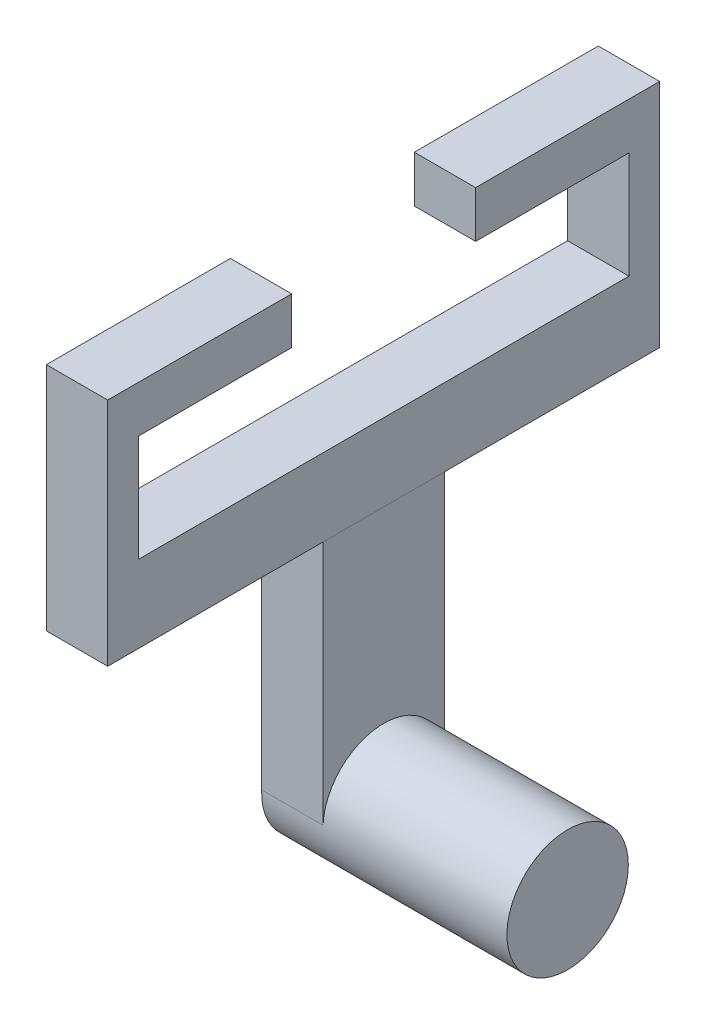
ISO-10303-21;
HEADER;
FILE_DESCRIPTION(('STEP AP214'),'2;1');
FILE_NAME('part.step','',(''),(''),'','','');
FILE_SCHEMA(('AUTOMOTIVE_DESIGN { 1 0 10303 214 1 1 1 1 }'));
ENDSEC;
DATA;
#1=APPLICATION_CONTEXT('core data for automotive mechanical design processes');
#2=APPLICATION_PROTOCOL_DEFINITION('international standard','automotive_design',2000,#1);
#3=PRODUCT_CONTEXT('',#1,'mechanical');
#4=PRODUCT('Part','Part','',(#3));
#5=PRODUCT_RELATED_PRODUCT_CATEGORY('part','',(#4));
#6=PRODUCT_DEFINITION_FORMATION('','',#4);
#7=PRODUCT_DEFINITION_CONTEXT('part definition',#1,'design');
#8=PRODUCT_DEFINITION('design','',#6,#7);
#9=PRODUCT_DEFINITION_SHAPE('','',#8);
#10=(LENGTH_UNIT() NAMED_UNIT(*) SI_UNIT(.MILLI.,.METRE.));
#11=(NAMED_UNIT(*) PLANE_ANGLE_UNIT() SI_UNIT($,.RADIAN.));
#12=(NAMED_UNIT(*) SI_UNIT($,.STERADIAN.) SOLID_ANGLE_UNIT());
#13=UNCERTAINTY_MEASURE_WITH_UNIT(LENGTH_MEASURE(1.E-05),#10,'distance_accuracy_value','');
#14=(GEOMETRIC_REPRESENTATION_CONTEXT(3) GLOBAL_UNCERTAINTY_ASSIGNED_CONTEXT((#13)) GLOBAL_UNIT_ASSIGNED_CONTEXT((#10,
#11,#12)) REPRESENTATION_CONTEXT('',''));
#15=CARTESIAN_POINT('',(0.,0.,0.));
#16=DIRECTION('',(0.,0.,1.));
#17=DIRECTION('',(1.,0.,0.));
#18=AXIS2_PLACEMENT_3D('',#15,#16,#17);
#19=CARTESIAN_POINT('',(12.7,51.3912941545788,-50.8));
#20=DIRECTION('',(0.,1.,0.));
#21=DIRECTION('',(0.,0.,1.));
#22=AXIS2_PLACEMENT_3D('',#19,#20,#21);
#23=PLANE('',#22);
#24=DIRECTION('',(0.,0.,-1.));
#25=VECTOR('',#24,1.);
#26=CARTESIAN_POINT('',(0.,51.3912941545788,-50.8));
#27=LINE('',#26,#25);
#28=CARTESIAN_POINT('',(0.,51.3912941545788,57.15));
#29=VERTEX_POINT('',#28);
#30=CARTESIAN_POINT('',(0.,51.3912941545788,-57.15));
#31=VERTEX_POINT('',#30);
#32=EDGE_CURVE('E273',#29,#31,#27,.T.);
#33=ORIENTED_EDGE('',*,*,#32,.T.);
#34=DIRECTION('',(1.,0.,0.));
#35=VECTOR('',#34,1.);
#36=CARTESIAN_POINT('',(0.,51.3912941545788,-57.15));
#37=LINE('',#36,#35);
#38=CARTESIAN_POINT('',(12.7,51.3912941545788,-57.15));
#39=VERTEX_POINT('',#38);
#40=EDGE_CURVE('E279',#31,#39,#37,.T.);
#41=ORIENTED_EDGE('',*,*,#40,.T.);
#42=DIRECTION('',(0.,0.,-1.));
#43=VECTOR('',#42,1.);
#44=CARTESIAN_POINT('',(12.7,51.3912941545788,-50.8));
#45=LINE('',#44,#43);
#46=CARTESIAN_POINT('',(12.7,51.3912941545788,57.15));
#47=VERTEX_POINT('',#46);
#48=EDGE_CURVE('E298',#47,#39,#45,.T.);
#49=ORIENTED_EDGE('',*,*,#48,.F.);
#50=DIRECTION('',(1.,0.,0.));
#51=VECTOR('',#50,1.);
#52=CARTESIAN_POINT('',(0.,51.3912941545788,57.15));
#53=LINE('',#52,#51);
#54=EDGE_CURVE('E272',#29,#47,#53,.T.);
#55=ORIENTED_EDGE('',*,*,#54,.F.);
#56=EDGE_LOOP('',(#33,#41,#49,#55));
#57=FACE_BOUND('',#56,.T.);
#58=ADVANCED_FACE('F89',(#57),#23,.F.);
#59=CARTESIAN_POINT('',(12.7,67.3932941545788,-50.8));
#60=DIRECTION('',(0.,-1.,0.));
#61=DIRECTION('',(0.,0.,-1.));
#62=AXIS2_PLACEMENT_3D('',#59,#60,#61);
#63=PLANE('',#62);
#64=DIRECTION('',(0.,0.,1.));
#65=VECTOR('',#64,1.);
#66=CARTESIAN_POINT('',(0.,67.3932941545788,-50.8));
#67=LINE('',#66,#65);
#68=CARTESIAN_POINT('',(0.,67.3932941545788,-50.8));
#69=VERTEX_POINT('',#68);
#70=CARTESIAN_POINT('',(0.,67.3932941545788,50.8));
#71=VERTEX_POINT('',#70);
#72=EDGE_CURVE('E299',#69,#71,#67,.T.);
#73=ORIENTED_EDGE('',*,*,#72,.T.);
#74=DIRECTION('',(-1.,0.,0.));
#75=VECTOR('',#74,1.);
#76=CARTESIAN_POINT('',(12.7,67.3932941545788,50.8));
#77=LINE('',#76,#75);
#78=CARTESIAN_POINT('',(12.7,67.3932941545788,50.8));
#79=VERTEX_POINT('',#78);
#80=EDGE_CURVE('E98',#79,#71,#77,.T.);
#81=ORIENTED_EDGE('',*,*,#80,.F.);
#82=DIRECTION('',(0.,0.,1.));
#83=VECTOR('',#82,1.);
#84=CARTESIAN_POINT('',(12.7,67.3932941545788,-50.8));
#85=LINE('',#84,#83);
#86=CARTESIAN_POINT('',(12.7,67.3932941545788,-50.8));
#87=VERTEX_POINT('',#86);
#88=EDGE_CURVE('E105',#87,#79,#85,.T.);
#89=ORIENTED_EDGE('',*,*,#88,.F.);
#90=DIRECTION('',(-1.,0.,0.));
#91=VECTOR('',#90,1.);
#92=CARTESIAN_POINT('',(12.7,67.3932941545788,-50.8));
#93=LINE('',#92,#91);
#94=EDGE_CURVE('E13',#87,#69,#93,.T.);
#95=ORIENTED_EDGE('',*,*,#94,.T.);
#96=EDGE_LOOP('',(#73,#81,#89,#95));
#97=FACE_BOUND('',#96,.T.);
#98=ADVANCED_FACE('F314',(#97),#63,.F.);
#99=CARTESIAN_POINT('',(12.7,0.,0.));
#100=DIRECTION('',(-1.,0.,0.));
#101=DIRECTION('',(0.,0.,1.));
#102=AXIS2_PLACEMENT_3D('',#99,#100,#101);
#103=PLANE('',#102);
#104=ORIENTED_EDGE('',*,*,#88,.T.);
#105=DIRECTION('',(0.,1.,0.));
#106=VECTOR('',#105,1.);
#107=CARTESIAN_POINT('',(12.7,51.3912941545788,50.8));
#108=LINE('',#107,#106);
#109=CARTESIAN_POINT('',(12.7,89.4912941545788,50.8));
#110=VERTEX_POINT('',#109);
#111=EDGE_CURVE('E265',#79,#110,#108,.T.);
#112=ORIENTED_EDGE('',*,*,#111,.T.);
#113=DIRECTION('',(0.,0.,-1.));
#114=VECTOR('',#113,1.);
#115=CARTESIAN_POINT('',(12.7,89.4912941545788,57.15));
#116=LINE('',#115,#114);
#117=CARTESIAN_POINT('',(12.7,89.4912941545788,19.05));
#118=VERTEX_POINT('',#117);
#119=EDGE_CURVE('E210',#110,#118,#116,.T.);
#120=ORIENTED_EDGE('',*,*,#119,.T.);
#121=DIRECTION('',(0.,1.,0.));
#122=VECTOR('',#121,1.);
#123=CARTESIAN_POINT('',(12.7,89.4912941545788,19.05));
#124=LINE('',#123,#122);
#125=CARTESIAN_POINT('',(12.7,99.1432941545788,19.05));
#126=VERTEX_POINT('',#125);
#127=EDGE_CURVE('E193',#118,#126,#124,.T.);
#128=ORIENTED_EDGE('',*,*,#127,.T.);
#129=DIRECTION('',(0.,0.,1.));
#130=VECTOR('',#129,1.);
#131=CARTESIAN_POINT('',(12.7,99.1432941545788,57.15));
#132=LINE('',#131,#130);
#133=CARTESIAN_POINT('',(12.7,99.1432941545788,57.15));
#134=VERTEX_POINT('',#133);
#135=EDGE_CURVE('E190',#126,#134,#132,.T.);
#136=ORIENTED_EDGE('',*,*,#135,.T.);
#137=DIRECTION('',(0.,-1.,0.));
#138=VECTOR('',#137,1.);
#139=CARTESIAN_POINT('',(12.7,51.3912941545788,57.15));
#140=LINE('',#139,#138);
#141=EDGE_CURVE('E260',#134,#47,#140,.T.);
#142=ORIENTED_EDGE('',*,*,#141,.T.);
#143=ORIENTED_EDGE('',*,*,#48,.T.);
#144=DIRECTION('',(0.,1.,0.));
#145=VECTOR('',#144,1.);
#146=CARTESIAN_POINT('',(12.7,51.3912941545788,-57.15));
#147=LINE('',#146,#145);
#148=CARTESIAN_POINT('',(12.7,99.1432941545788,-57.15));
#149=VERTEX_POINT('',#148);
#150=EDGE_CURVE('E286',#39,#149,#147,.T.);
#151=ORIENTED_EDGE('',*,*,#150,.T.);
#152=DIRECTION('',(0.,0.,1.));
#153=VECTOR('',#152,1.);
#154=CARTESIAN_POINT('',(12.7,99.1432941545788,-57.15));
#155=LINE('',#154,#153);
#156=CARTESIAN_POINT('',(12.7,99.1432941545788,-19.05));
#157=VERTEX_POINT('',#156);
#158=EDGE_CURVE('E208',#149,#157,#155,.T.);
#159=ORIENTED_EDGE('',*,*,#158,.T.);
#160=DIRECTION('',(0.,-1.,0.));
#161=VECTOR('',#160,1.);
#162=CARTESIAN_POINT('',(12.7,89.4912941545788,-19.05));
#163=LINE('',#162,#161);
#164=CARTESIAN_POINT('',(12.7,89.4912941545788,-19.05));
#165=VERTEX_POINT('',#164);
#166=EDGE_CURVE('E238',#157,#165,#163,.T.);
#167=ORIENTED_EDGE('',*,*,#166,.T.);
#168=DIRECTION('',(0.,0.,-1.));
#169=VECTOR('',#168,1.);
#170=CARTESIAN_POINT('',(12.7,89.4912941545788,-57.15));
#171=LINE('',#170,#169);
#172=CARTESIAN_POINT('',(12.7,89.4912941545788,-50.8));
#173=VERTEX_POINT('',#172);
#174=EDGE_CURVE('E234',#165,#173,#171,.T.);
#175=ORIENTED_EDGE('',*,*,#174,.T.);
#176=DIRECTION('',(0.,-1.,0.));
#177=VECTOR('',#176,1.);
#178=CARTESIAN_POINT('',(12.7,51.3912941545788,-50.8));
#179=LINE('',#178,#177);
#180=EDGE_CURVE('E270',#173,#87,#179,.T.);
#181=ORIENTED_EDGE('',*,*,#180,.T.);
#182=EDGE_LOOP('',(#104,#112,#120,#128,#136,#142,#143,#151,#159,#167,#175,#181));
#183=FACE_BOUND('',#182,.T.);
#184=ADVANCED_FACE('F319',(#183),#103,.F.);
#185=CARTESIAN_POINT('',(0.,0.,0.));
#186=DIRECTION('',(-1.,0.,0.));
#187=DIRECTION('',(0.,0.,1.));
#188=AXIS2_PLACEMENT_3D('',#185,#186,#187);
#189=PLANE('',#188);
#190=ORIENTED_EDGE('',*,*,#32,.F.);
#191=DIRECTION('',(0.,-1.,0.));
#192=VECTOR('',#191,1.);
#193=CARTESIAN_POINT('',(0.,51.3912941545788,57.15));
#194=LINE('',#193,#192);
#195=CARTESIAN_POINT('',(0.,99.1432941545788,57.15));
#196=VERTEX_POINT('',#195);
#197=EDGE_CURVE('E258',#196,#29,#194,.T.);
#198=ORIENTED_EDGE('',*,*,#197,.F.);
#199=DIRECTION('',(0.,0.,1.));
#200=VECTOR('',#199,1.);
#201=CARTESIAN_POINT('',(0.,99.1432941545788,57.15));
#202=LINE('',#201,#200);
#203=CARTESIAN_POINT('',(0.,99.1432941545788,19.05));
#204=VERTEX_POINT('',#203);
#205=EDGE_CURVE('E199',#204,#196,#202,.T.);
#206=ORIENTED_EDGE('',*,*,#205,.F.);
#207=DIRECTION('',(0.,1.,0.));
#208=VECTOR('',#207,1.);
#209=CARTESIAN_POINT('',(0.,89.4912941545788,19.05));
#210=LINE('',#209,#208);
#211=CARTESIAN_POINT('',(0.,89.4912941545788,19.05));
#212=VERTEX_POINT('',#211);
#213=EDGE_CURVE('E187',#212,#204,#210,.T.);
#214=ORIENTED_EDGE('',*,*,#213,.F.);
#215=DIRECTION('',(0.,0.,-1.));
#216=VECTOR('',#215,1.);
#217=CARTESIAN_POINT('',(0.,89.4912941545788,57.15));
#218=LINE('',#217,#216);
#219=CARTESIAN_POINT('',(0.,89.4912941545788,50.8));
#220=VERTEX_POINT('',#219);
#221=EDGE_CURVE('E172',#220,#212,#218,.T.);
#222=ORIENTED_EDGE('',*,*,#221,.F.);
#223=DIRECTION('',(0.,1.,0.));
#224=VECTOR('',#223,1.);
#225=CARTESIAN_POINT('',(0.,51.3912941545788,50.8));
#226=LINE('',#225,#224);
#227=EDGE_CURVE('E256',#71,#220,#226,.T.);
#228=ORIENTED_EDGE('',*,*,#227,.F.);
#229=ORIENTED_EDGE('',*,*,#72,.F.);
#230=DIRECTION('',(0.,-1.,0.));
#231=VECTOR('',#230,1.);
#232=CARTESIAN_POINT('',(0.,51.3912941545788,-50.8));
#233=LINE('',#232,#231);
#234=CARTESIAN_POINT('',(0.,89.4912941545788,-50.8));
#235=VERTEX_POINT('',#234);
#236=EDGE_CURVE('E288',#235,#69,#233,.T.);
#237=ORIENTED_EDGE('',*,*,#236,.F.);
#238=DIRECTION('',(0.,0.,-1.));
#239=VECTOR('',#238,1.);
#240=CARTESIAN_POINT('',(0.,89.4912941545788,-57.15));
#241=LINE('',#240,#239);
#242=CARTESIAN_POINT('',(0.,89.4912941545788,-19.05));
#243=VERTEX_POINT('',#242);
#244=EDGE_CURVE('E227',#243,#235,#241,.T.);
#245=ORIENTED_EDGE('',*,*,#244,.F.);
#246=DIRECTION('',(0.,-1.,0.));
#247=VECTOR('',#246,1.);
#248=CARTESIAN_POINT('',(0.,89.4912941545788,-19.05));
#249=LINE('',#248,#247);
#250=CARTESIAN_POINT('',(0.,99.1432941545788,-19.05));
#251=VERTEX_POINT('',#250);
#252=EDGE_CURVE('E248',#251,#243,#249,.T.);
#253=ORIENTED_EDGE('',*,*,#252,.F.);
#254=DIRECTION('',(0.,0.,1.));
#255=VECTOR('',#254,1.);
#256=CARTESIAN_POINT('',(0.,99.1432941545788,-57.15));
#257=LINE('',#256,#255);
#258=CARTESIAN_POINT('',(0.,99.1432941545788,-57.15));
#259=VERTEX_POINT('',#258);
#260=EDGE_CURVE('E237',#259,#251,#257,.T.);
#261=ORIENTED_EDGE('',*,*,#260,.F.);
#262=DIRECTION('',(0.,1.,0.));
#263=VECTOR('',#262,1.);
#264=CARTESIAN_POINT('',(0.,51.3912941545788,-57.15));
#265=LINE('',#264,#263);
#266=EDGE_CURVE('E284',#31,#259,#265,.T.);
#267=ORIENTED_EDGE('',*,*,#266,.F.);
#268=EDGE_LOOP('',(#190,#198,#206,#214,#222,#228,#229,#237,#245,#253,#261,#267));
#269=FACE_BOUND('',#268,.T.);
#270=ADVANCED_FACE('F200',(#269),#189,.T.);
#271=CARTESIAN_POINT('',(0.,51.3912941545788,-50.8));
#272=DIRECTION('',(0.,0.,1.));
#273=DIRECTION('',(1.,0.,0.));
#274=AXIS2_PLACEMENT_3D('',#271,#272,#273);
#275=PLANE('',#274);
#276=ORIENTED_EDGE('',*,*,#94,.F.);
#277=ORIENTED_EDGE('',*,*,#180,.F.);
#278=DIRECTION('',(1.,0.,0.));
#279=VECTOR('',#278,1.);
#280=CARTESIAN_POINT('',(0.,89.4912941545788,-50.8));
#281=LINE('',#280,#279);
#282=EDGE_CURVE('E216',#235,#173,#281,.T.);
#283=ORIENTED_EDGE('',*,*,#282,.F.);
#284=ORIENTED_EDGE('',*,*,#236,.T.);
#285=EDGE_LOOP('',(#276,#277,#283,#284));
#286=FACE_BOUND('',#285,.T.);
#287=ADVANCED_FACE('F320',(#286),#275,.T.);
#288=CARTESIAN_POINT('',(0.,51.3912941545788,-57.15));
#289=DIRECTION('',(0.,0.,-1.));
#290=DIRECTION('',(-1.,0.,0.));
#291=AXIS2_PLACEMENT_3D('',#288,#289,#290);
#292=PLANE('',#291);
#293=ORIENTED_EDGE('',*,*,#150,.F.);
#294=ORIENTED_EDGE('',*,*,#40,.F.);
#295=ORIENTED_EDGE('',*,*,#266,.T.);
#296=DIRECTION('',(1.,0.,0.));
#297=VECTOR('',#296,1.);
#298=CARTESIAN_POINT('',(0.,99.1432941545788,-57.15));
#299=LINE('',#298,#297);
#300=EDGE_CURVE('E222',#259,#149,#299,.T.);
#301=ORIENTED_EDGE('',*,*,#300,.T.);
#302=EDGE_LOOP('',(#293,#294,#295,#301));
#303=FACE_BOUND('',#302,.T.);
#304=ADVANCED_FACE('F332',(#303),#292,.T.);
#305=CARTESIAN_POINT('',(0.,51.3912941545788,50.8));
#306=DIRECTION('',(0.,0.,-1.));
#307=DIRECTION('',(-1.,0.,0.));
#308=AXIS2_PLACEMENT_3D('',#305,#306,#307);
#309=PLANE('',#308);
#310=ORIENTED_EDGE('',*,*,#111,.F.);
#311=ORIENTED_EDGE('',*,*,#80,.T.);
#312=ORIENTED_EDGE('',*,*,#227,.T.);
#313=DIRECTION('',(1.,0.,0.));
#314=VECTOR('',#313,1.);
#315=CARTESIAN_POINT('',(0.,89.4912941545788,50.8));
#316=LINE('',#315,#314);
#317=EDGE_CURVE('E179',#220,#110,#316,.T.);
#318=ORIENTED_EDGE('',*,*,#317,.T.);
#319=EDGE_LOOP('',(#310,#311,#312,#318));
#320=FACE_BOUND('',#319,.T.);
#321=ADVANCED_FACE('F309',(#320),#309,.T.);
#322=CARTESIAN_POINT('',(0.,51.3912941545788,57.15));
#323=DIRECTION('',(0.,0.,1.));
#324=DIRECTION('',(1.,0.,0.));
#325=AXIS2_PLACEMENT_3D('',#322,#323,#324);
#326=PLANE('',#325);
#327=ORIENTED_EDGE('',*,*,#141,.F.);
#328=DIRECTION('',(1.,0.,0.));
#329=VECTOR('',#328,1.);
#330=CARTESIAN_POINT('',(0.,99.1432941545788,57.15));
#331=LINE('',#330,#329);
#332=EDGE_CURVE('E218',#196,#134,#331,.T.);
#333=ORIENTED_EDGE('',*,*,#332,.F.);
#334=ORIENTED_EDGE('',*,*,#197,.T.);
#335=ORIENTED_EDGE('',*,*,#54,.T.);
#336=EDGE_LOOP('',(#327,#333,#334,#335));
#337=FACE_BOUND('',#336,.T.);
#338=ADVANCED_FACE('F339',(#337),#326,.T.);
#339=CARTESIAN_POINT('',(0.,89.4912941545788,57.15));
#340=DIRECTION('',(0.,-1.,0.));
#341=DIRECTION('',(0.,0.,-1.));
#342=AXIS2_PLACEMENT_3D('',#339,#340,#341);
#343=PLANE('',#342);
#344=ORIENTED_EDGE('',*,*,#317,.F.);
#345=ORIENTED_EDGE('',*,*,#221,.T.);
#346=DIRECTION('',(1.,0.,0.));
#347=VECTOR('',#346,1.);
#348=CARTESIAN_POINT('',(0.,89.4912941545788,19.05));
#349=LINE('',#348,#347);
#350=EDGE_CURVE('E180',#212,#118,#349,.T.);
#351=ORIENTED_EDGE('',*,*,#350,.T.);
#352=ORIENTED_EDGE('',*,*,#119,.F.);
#353=EDGE_LOOP('',(#344,#345,#351,#352));
#354=FACE_BOUND('',#353,.T.);
#355=ADVANCED_FACE('F176',(#354),#343,.T.);
#356=CARTESIAN_POINT('',(0.,99.1432941545788,57.15));
#357=DIRECTION('',(0.,1.,0.));
#358=DIRECTION('',(0.,0.,1.));
#359=AXIS2_PLACEMENT_3D('',#356,#357,#358);
#360=PLANE('',#359);
#361=ORIENTED_EDGE('',*,*,#135,.F.);
#362=DIRECTION('',(1.,0.,0.));
#363=VECTOR('',#362,1.);
#364=CARTESIAN_POINT('',(0.,99.1432941545788,19.05));
#365=LINE('',#364,#363);
#366=EDGE_CURVE('E198',#204,#126,#365,.T.);
#367=ORIENTED_EDGE('',*,*,#366,.F.);
#368=ORIENTED_EDGE('',*,*,#205,.T.);
#369=ORIENTED_EDGE('',*,*,#332,.T.);
#370=EDGE_LOOP('',(#361,#367,#368,#369));
#371=FACE_BOUND('',#370,.T.);
#372=ADVANCED_FACE('F342',(#371),#360,.T.);
#373=CARTESIAN_POINT('',(0.,89.4912941545788,19.05));
#374=DIRECTION('',(0.,0.,-1.));
#375=DIRECTION('',(-1.,0.,0.));
#376=AXIS2_PLACEMENT_3D('',#373,#374,#375);
#377=PLANE('',#376);
#378=ORIENTED_EDGE('',*,*,#127,.F.);
#379=ORIENTED_EDGE('',*,*,#350,.F.);
#380=ORIENTED_EDGE('',*,*,#213,.T.);
#381=ORIENTED_EDGE('',*,*,#366,.T.);
#382=EDGE_LOOP('',(#378,#379,#380,#381));
#383=FACE_BOUND('',#382,.T.);
#384=ADVANCED_FACE('F191',(#383),#377,.T.);
#385=CARTESIAN_POINT('',(0.,89.4912941545788,-57.15));
#386=DIRECTION('',(0.,-1.,0.));
#387=DIRECTION('',(0.,0.,-1.));
#388=AXIS2_PLACEMENT_3D('',#385,#386,#387);
#389=PLANE('',#388);
#390=ORIENTED_EDGE('',*,*,#244,.T.);
#391=ORIENTED_EDGE('',*,*,#282,.T.);
#392=ORIENTED_EDGE('',*,*,#174,.F.);
#393=DIRECTION('',(1.,0.,0.));
#394=VECTOR('',#393,1.);
#395=CARTESIAN_POINT('',(0.,89.4912941545788,-19.05));
#396=LINE('',#395,#394);
#397=EDGE_CURVE('E233',#243,#165,#396,.T.);
#398=ORIENTED_EDGE('',*,*,#397,.F.);
#399=EDGE_LOOP('',(#390,#391,#392,#398));
#400=FACE_BOUND('',#399,.T.);
#401=ADVANCED_FACE('F322',(#400),#389,.T.);
#402=CARTESIAN_POINT('',(0.,89.4912941545788,-19.05));
#403=DIRECTION('',(0.,0.,1.));
#404=DIRECTION('',(1.,0.,0.));
#405=AXIS2_PLACEMENT_3D('',#402,#403,#404);
#406=PLANE('',#405);
#407=ORIENTED_EDGE('',*,*,#166,.F.);
#408=DIRECTION('',(1.,0.,0.));
#409=VECTOR('',#408,1.);
#410=CARTESIAN_POINT('',(0.,99.1432941545788,-19.05));
#411=LINE('',#410,#409);
#412=EDGE_CURVE('E226',#251,#157,#411,.T.);
#413=ORIENTED_EDGE('',*,*,#412,.F.);
#414=ORIENTED_EDGE('',*,*,#252,.T.);
#415=ORIENTED_EDGE('',*,*,#397,.T.);
#416=EDGE_LOOP('',(#407,#413,#414,#415));
#417=FACE_BOUND('',#416,.T.);
#418=ADVANCED_FACE('F375',(#417),#406,.T.);
#419=CARTESIAN_POINT('',(0.,99.1432941545788,-57.15));
#420=DIRECTION('',(0.,1.,0.));
#421=DIRECTION('',(0.,0.,1.));
#422=AXIS2_PLACEMENT_3D('',#419,#420,#421);
#423=PLANE('',#422);
#424=ORIENTED_EDGE('',*,*,#158,.F.);
#425=ORIENTED_EDGE('',*,*,#300,.F.);
#426=ORIENTED_EDGE('',*,*,#260,.T.);
#427=ORIENTED_EDGE('',*,*,#412,.T.);
#428=EDGE_LOOP('',(#424,#425,#426,#427));
#429=FACE_BOUND('',#428,.T.);
#430=ADVANCED_FACE('F326',(#429),#423,.T.);
#431=CLOSED_SHELL('',(#58,#98,#184,#270,#287,#304,#321,#338,#355,#372,#384,#401,#418,#430));
#432=MANIFOLD_SOLID_BREP('B2',#431);
#433=CARTESIAN_POINT('',(50.8,0.,0.));
#434=DIRECTION('',(-1.,0.,0.));
#435=DIRECTION('',(0.,0.,1.));
#436=AXIS2_PLACEMENT_3D('',#433,#434,#435);
#437=CYLINDRICAL_SURFACE('',#436,12.573);
#438=CARTESIAN_POINT('',(50.8,0.,0.));
#439=DIRECTION('',(1.,0.,0.));
#440=DIRECTION('',(0.,0.,-1.));
#441=AXIS2_PLACEMENT_3D('',#438,#439,#440);
#442=CIRCLE('',#441,12.573);
#443=CARTESIAN_POINT('',(50.8,0.,-12.573));
#444=VERTEX_POINT('',#443);
#445=EDGE_CURVE('E543',#444,#444,#442,.T.);
#446=ORIENTED_EDGE('',*,*,#445,.F.);
#447=EDGE_LOOP('',(#446));
#448=FACE_BOUND('',#447,.T.);
#449=CARTESIAN_POINT('',(12.7,0.,0.));
#450=DIRECTION('',(1.,0.,0.));
#451=DIRECTION('',(0.,0.,-1.));
#452=AXIS2_PLACEMENT_3D('',#449,#450,#451);
#453=CIRCLE('',#452,12.573);
#454=CARTESIAN_POINT('',(12.7,0.602645545887878,-12.5585487754765));
#455=VERTEX_POINT('',#454);
#456=CARTESIAN_POINT('',(12.7,0.602645545887878,12.5585487754765));
#457=VERTEX_POINT('',#456);
#458=EDGE_CURVE('E85',#455,#457,#453,.T.);
#459=ORIENTED_EDGE('',*,*,#458,.T.);
#460=DIRECTION('',(-1.,0.,0.));
#461=VECTOR('',#460,1.);
#462=CARTESIAN_POINT('',(50.8,0.602645545887878,12.5585487754765));
#463=LINE('',#462,#461);
#464=CARTESIAN_POINT('',(0.,0.602645545887878,12.5585487754765));
#465=VERTEX_POINT('',#464);
#466=EDGE_CURVE('E611',#457,#465,#463,.T.);
#467=ORIENTED_EDGE('',*,*,#466,.T.);
#468=CARTESIAN_POINT('',(0.,0.,0.));
#469=DIRECTION('',(1.,0.,0.));
#470=DIRECTION('',(0.,0.,-1.));
#471=AXIS2_PLACEMENT_3D('',#468,#469,#470);
#472=CIRCLE('',#471,12.573);
#473=CARTESIAN_POINT('',(0.,0.602645545887878,-12.5585487754765));
#474=VERTEX_POINT('',#473);
#475=EDGE_CURVE('E597',#465,#474,#472,.T.);
#476=ORIENTED_EDGE('',*,*,#475,.T.);
#477=DIRECTION('',(-1.,0.,0.));
#478=VECTOR('',#477,1.);
#479=CARTESIAN_POINT('',(12.7,0.602645545887878,-12.5585487754765));
#480=LINE('',#479,#478);
#481=EDGE_CURVE('E587',#455,#474,#480,.T.);
#482=ORIENTED_EDGE('',*,*,#481,.F.);
#483=EDGE_LOOP('',(#459,#467,#476,#482));
#484=FACE_BOUND('',#483,.T.);
#485=ADVANCED_FACE('F531',(#448,#484),#437,.T.);
#486=CARTESIAN_POINT('',(50.8,0.,0.));
#487=DIRECTION('',(1.,0.,0.));
#488=DIRECTION('',(0.,0.,-1.));
#489=AXIS2_PLACEMENT_3D('',#486,#487,#488);
#490=PLANE('',#489);
#491=ORIENTED_EDGE('',*,*,#445,.T.);
#492=EDGE_LOOP('',(#491));
#493=FACE_BOUND('',#492,.T.);
#494=ADVANCED_FACE('F663',(#493),#490,.T.);
#495=CARTESIAN_POINT('',(0.,0.,0.));
#496=DIRECTION('',(1.,0.,0.));
#497=DIRECTION('',(0.,0.,-1.));
#498=AXIS2_PLACEMENT_3D('',#495,#496,#497);
#499=PLANE('',#498);
#500=ORIENTED_EDGE('',*,*,#475,.F.);
#501=DIRECTION('',(0.,0.,1.));
#502=VECTOR('',#501,1.);
#503=CARTESIAN_POINT('',(0.,0.602645545887878,-12.5585487754765));
#504=LINE('',#503,#502);
#505=CARTESIAN_POINT('',(0.,0.602645545887878,12.5874512245235));
#506=VERTEX_POINT('',#505);
#507=EDGE_CURVE('E554',#465,#506,#504,.T.);
#508=ORIENTED_EDGE('',*,*,#507,.T.);
#509=DIRECTION('',(0.,1.,0.));
#510=VECTOR('',#509,1.);
#511=CARTESIAN_POINT('',(0.,0.602645545887878,12.5874512245235));
#512=LINE('',#511,#510);
#513=CARTESIAN_POINT('',(0.,51.4026455458879,12.5874512245235));
#514=VERTEX_POINT('',#513);
#515=EDGE_CURVE('E625',#506,#514,#512,.T.);
#516=ORIENTED_EDGE('',*,*,#515,.T.);
#517=DIRECTION('',(0.,0.,-1.));
#518=VECTOR('',#517,1.);
#519=CARTESIAN_POINT('',(0.,51.4026455458879,-12.5585487754765));
#520=LINE('',#519,#518);
#521=CARTESIAN_POINT('',(0.,51.4026455458879,-12.5585487754765));
#522=VERTEX_POINT('',#521);
#523=EDGE_CURVE('E595',#514,#522,#520,.T.);
#524=ORIENTED_EDGE('',*,*,#523,.T.);
#525=DIRECTION('',(0.,-1.,0.));
#526=VECTOR('',#525,1.);
#527=CARTESIAN_POINT('',(0.,0.602645545887878,-12.5585487754765));
#528=LINE('',#527,#526);
#529=EDGE_CURVE('E621',#522,#474,#528,.T.);
#530=ORIENTED_EDGE('',*,*,#529,.T.);
#531=EDGE_LOOP('',(#500,#508,#516,#524,#530));
#532=FACE_BOUND('',#531,.T.);
#533=ADVANCED_FACE('F656',(#532),#499,.F.);
#534=CARTESIAN_POINT('',(12.7,0.602645545887878,-12.5585487754765));
#535=DIRECTION('',(0.,-1.,0.));
#536=DIRECTION('',(0.,0.,-1.));
#537=AXIS2_PLACEMENT_3D('',#534,#535,#536);
#538=PLANE('',#537);
#539=ORIENTED_EDGE('',*,*,#466,.F.);
#540=DIRECTION('',(0.,0.,1.));
#541=VECTOR('',#540,1.);
#542=CARTESIAN_POINT('',(12.7,0.602645545887878,-12.5585487754765));
#543=LINE('',#542,#541);
#544=CARTESIAN_POINT('',(12.7,0.602645545887878,12.5874512245235));
#545=VERTEX_POINT('',#544);
#546=EDGE_CURVE('E547',#457,#545,#543,.T.);
#547=ORIENTED_EDGE('',*,*,#546,.T.);
#548=DIRECTION('',(-1.,0.,0.));
#549=VECTOR('',#548,1.);
#550=CARTESIAN_POINT('',(12.7,0.602645545887878,12.5874512245235));
#551=LINE('',#550,#549);
#552=EDGE_CURVE('E596',#545,#506,#551,.T.);
#553=ORIENTED_EDGE('',*,*,#552,.T.);
#554=ORIENTED_EDGE('',*,*,#507,.F.);
#555=EDGE_LOOP('',(#539,#547,#553,#554));
#556=FACE_BOUND('',#555,.T.);
#557=ADVANCED_FACE('F660',(#556),#538,.T.);
#558=CARTESIAN_POINT('',(12.7,0.602645545887878,-12.5585487754765));
#559=DIRECTION('',(0.,0.,-1.));
#560=DIRECTION('',(0.,1.,0.));
#561=AXIS2_PLACEMENT_3D('',#558,#559,#560);
#562=PLANE('',#561);
#563=ORIENTED_EDGE('',*,*,#529,.F.);
#564=DIRECTION('',(-1.,0.,0.));
#565=VECTOR('',#564,1.);
#566=CARTESIAN_POINT('',(12.7,51.4026455458879,-12.5585487754765));
#567=LINE('',#566,#565);
#568=CARTESIAN_POINT('',(12.7,51.4026455458879,-12.5585487754765));
#569=VERTEX_POINT('',#568);
#570=EDGE_CURVE('E586',#569,#522,#567,.T.);
#571=ORIENTED_EDGE('',*,*,#570,.F.);
#572=DIRECTION('',(0.,-1.,0.));
#573=VECTOR('',#572,1.);
#574=CARTESIAN_POINT('',(12.7,0.602645545887878,-12.5585487754765));
#575=LINE('',#574,#573);
#576=EDGE_CURVE('E581',#569,#455,#575,.T.);
#577=ORIENTED_EDGE('',*,*,#576,.T.);
#578=ORIENTED_EDGE('',*,*,#481,.T.);
#579=EDGE_LOOP('',(#563,#571,#577,#578));
#580=FACE_BOUND('',#579,.T.);
#581=ADVANCED_FACE('F589',(#580),#562,.T.);
#582=CARTESIAN_POINT('',(12.7,51.4026455458879,-12.5585487754765));
#583=DIRECTION('',(0.,1.,0.));
#584=DIRECTION('',(0.,0.,1.));
#585=AXIS2_PLACEMENT_3D('',#582,#583,#584);
#586=PLANE('',#585);
#587=ORIENTED_EDGE('',*,*,#523,.F.);
#588=DIRECTION('',(-1.,0.,0.));
#589=VECTOR('',#588,1.);
#590=CARTESIAN_POINT('',(12.7,51.4026455458879,12.5874512245235));
#591=LINE('',#590,#589);
#592=CARTESIAN_POINT('',(12.7,51.4026455458879,12.5874512245235));
#593=VERTEX_POINT('',#592);
#594=EDGE_CURVE('E603',#593,#514,#591,.T.);
#595=ORIENTED_EDGE('',*,*,#594,.F.);
#596=DIRECTION('',(0.,0.,-1.));
#597=VECTOR('',#596,1.);
#598=CARTESIAN_POINT('',(12.7,51.4026455458879,-12.5585487754765));
#599=LINE('',#598,#597);
#600=EDGE_CURVE('E599',#593,#569,#599,.T.);
#601=ORIENTED_EDGE('',*,*,#600,.T.);
#602=ORIENTED_EDGE('',*,*,#570,.T.);
#603=EDGE_LOOP('',(#587,#595,#601,#602));
#604=FACE_BOUND('',#603,.T.);
#605=ADVANCED_FACE('F655',(#604),#586,.T.);
#606=CARTESIAN_POINT('',(12.7,0.602645545887878,12.5874512245235));
#607=DIRECTION('',(0.,0.,1.));
#608=DIRECTION('',(0.,-1.,0.));
#609=AXIS2_PLACEMENT_3D('',#606,#607,#608);
#610=PLANE('',#609);
#611=ORIENTED_EDGE('',*,*,#515,.F.);
#612=ORIENTED_EDGE('',*,*,#552,.F.);
#613=DIRECTION('',(0.,1.,0.));
#614=VECTOR('',#613,1.);
#615=CARTESIAN_POINT('',(12.7,0.602645545887878,12.5874512245235));
#616=LINE('',#615,#614);
#617=EDGE_CURVE('E609',#545,#593,#616,.T.);
#618=ORIENTED_EDGE('',*,*,#617,.T.);
#619=ORIENTED_EDGE('',*,*,#594,.T.);
#620=EDGE_LOOP('',(#611,#612,#618,#619));
#621=FACE_BOUND('',#620,.T.);
#622=ADVANCED_FACE('F652',(#621),#610,.T.);
#623=CARTESIAN_POINT('',(12.7,0.,0.));
#624=DIRECTION('',(1.,0.,0.));
#625=DIRECTION('',(0.,0.,-1.));
#626=AXIS2_PLACEMENT_3D('',#623,#624,#625);
#627=PLANE('',#626);
#628=ORIENTED_EDGE('',*,*,#458,.F.);
#629=ORIENTED_EDGE('',*,*,#576,.F.);
#630=ORIENTED_EDGE('',*,*,#600,.F.);
#631=ORIENTED_EDGE('',*,*,#617,.F.);
#632=ORIENTED_EDGE('',*,*,#546,.F.);
#633=EDGE_LOOP('',(#628,#629,#630,#631,#632));
#634=FACE_BOUND('',#633,.T.);
#635=ADVANCED_FACE('F576',(#634),#627,.T.);
#636=CLOSED_SHELL('',(#485,#494,#533,#557,#581,#605,#622,#635));
#637=MANIFOLD_SOLID_BREP('B7',#636);
#638=ADVANCED_BREP_SHAPE_REPRESENTATION('',(#18,#432,#637),#14);
#639=SHAPE_DEFINITION_REPRESENTATION(#9,#638);
ENDSEC;
END-ISO-10303-21;
